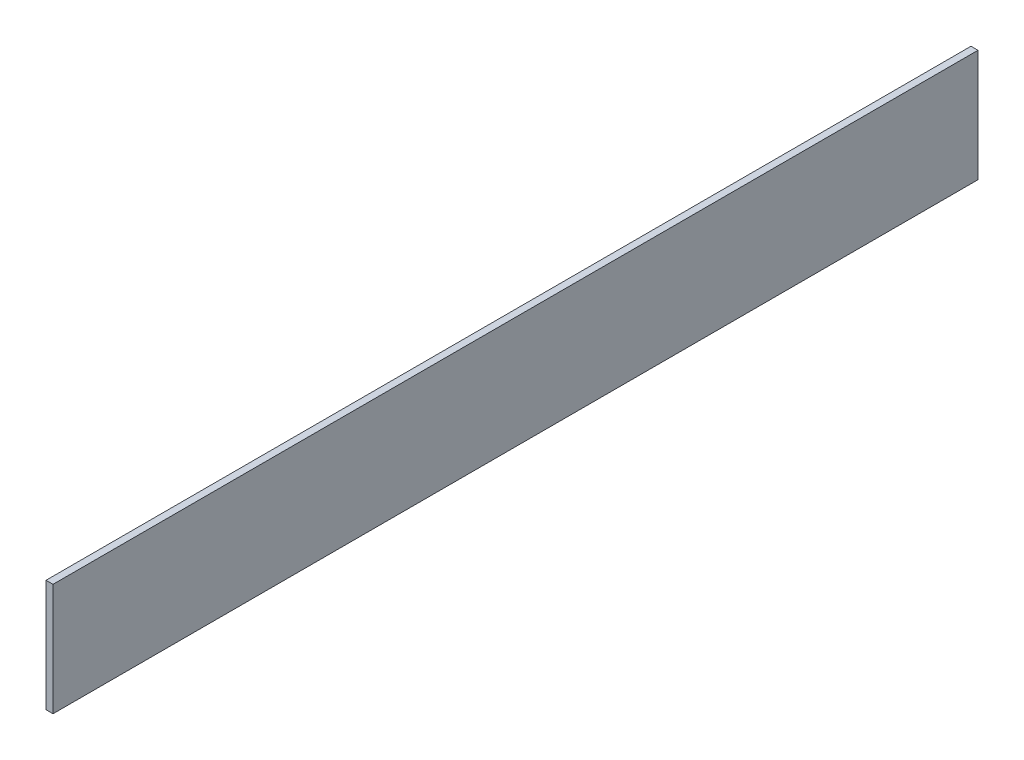
ISO-10303-21;
HEADER;
FILE_DESCRIPTION(('STEP AP214'),'2;1');
FILE_NAME('part.step','',(''),(''),'','','');
FILE_SCHEMA(('AUTOMOTIVE_DESIGN { 1 0 10303 214 1 1 1 1 }'));
ENDSEC;
DATA;
#1=APPLICATION_CONTEXT('core data for automotive mechanical design processes');
#2=APPLICATION_PROTOCOL_DEFINITION('international standard','automotive_design',2000,#1);
#3=PRODUCT_CONTEXT('',#1,'mechanical');
#4=PRODUCT('Part','Part','',(#3));
#5=PRODUCT_RELATED_PRODUCT_CATEGORY('part','',(#4));
#6=PRODUCT_DEFINITION_FORMATION('','',#4);
#7=PRODUCT_DEFINITION_CONTEXT('part definition',#1,'design');
#8=PRODUCT_DEFINITION('design','',#6,#7);
#9=PRODUCT_DEFINITION_SHAPE('','',#8);
#10=(LENGTH_UNIT() NAMED_UNIT(*) SI_UNIT(.MILLI.,.METRE.));
#11=(NAMED_UNIT(*) PLANE_ANGLE_UNIT() SI_UNIT($,.RADIAN.));
#12=(NAMED_UNIT(*) SI_UNIT($,.STERADIAN.) SOLID_ANGLE_UNIT());
#13=UNCERTAINTY_MEASURE_WITH_UNIT(LENGTH_MEASURE(1.E-05),#10,'distance_accuracy_value','');
#14=(GEOMETRIC_REPRESENTATION_CONTEXT(3) GLOBAL_UNCERTAINTY_ASSIGNED_CONTEXT((#13)) GLOBAL_UNIT_ASSIGNED_CONTEXT((#10,
#11,#12)) REPRESENTATION_CONTEXT('',''));
#15=CARTESIAN_POINT('',(0.,0.,0.));
#16=DIRECTION('',(0.,0.,1.));
#17=DIRECTION('',(1.,0.,0.));
#18=AXIS2_PLACEMENT_3D('',#15,#16,#17);
#19=CARTESIAN_POINT('',(185.,552.,-565.));
#20=DIRECTION('',(-1.,0.,0.));
#21=DIRECTION('',(0.,0.,1.));
#22=AXIS2_PLACEMENT_3D('',#19,#20,#21);
#23=PLANE('',#22);
#24=DIRECTION('',(0.,-1.,0.));
#25=VECTOR('',#24,1.);
#26=CARTESIAN_POINT('',(185.,552.,-235.));
#27=LINE('',#26,#25);
#28=CARTESIAN_POINT('',(185.,592.,-235.));
#29=VERTEX_POINT('',#28);
#30=CARTESIAN_POINT('',(185.,552.,-235.));
#31=VERTEX_POINT('',#30);
#32=EDGE_CURVE('E103',#29,#31,#27,.T.);
#33=ORIENTED_EDGE('',*,*,#32,.F.);
#34=DIRECTION('',(0.,0.,1.));
#35=VECTOR('',#34,1.);
#36=CARTESIAN_POINT('',(185.,592.,-565.));
#37=LINE('',#36,#35);
#38=CARTESIAN_POINT('',(185.,592.,-565.));
#39=VERTEX_POINT('',#38);
#40=EDGE_CURVE('E11',#39,#29,#37,.T.);
#41=ORIENTED_EDGE('',*,*,#40,.F.);
#42=DIRECTION('',(0.,-1.,0.));
#43=VECTOR('',#42,1.);
#44=CARTESIAN_POINT('',(185.,552.,-565.));
#45=LINE('',#44,#43);
#46=CARTESIAN_POINT('',(185.,552.,-565.));
#47=VERTEX_POINT('',#46);
#48=EDGE_CURVE('E97',#39,#47,#45,.T.);
#49=ORIENTED_EDGE('',*,*,#48,.T.);
#50=DIRECTION('',(0.,0.,1.));
#51=VECTOR('',#50,1.);
#52=CARTESIAN_POINT('',(185.,552.,-565.));
#53=LINE('',#52,#51);
#54=EDGE_CURVE('E42',#47,#31,#53,.T.);
#55=ORIENTED_EDGE('',*,*,#54,.T.);
#56=EDGE_LOOP('',(#33,#41,#49,#55));
#57=FACE_BOUND('',#56,.T.);
#58=ADVANCED_FACE('F39',(#57),#23,.T.);
#59=CARTESIAN_POINT('',(185.,592.,-565.));
#60=DIRECTION('',(0.,1.,0.));
#61=DIRECTION('',(0.,0.,1.));
#62=AXIS2_PLACEMENT_3D('',#59,#60,#61);
#63=PLANE('',#62);
#64=DIRECTION('',(-1.,0.,0.));
#65=VECTOR('',#64,1.);
#66=CARTESIAN_POINT('',(185.,592.,-235.));
#67=LINE('',#66,#65);
#68=CARTESIAN_POINT('',(187.5,592.,-235.));
#69=VERTEX_POINT('',#68);
#70=EDGE_CURVE('E99',#69,#29,#67,.T.);
#71=ORIENTED_EDGE('',*,*,#70,.F.);
#72=DIRECTION('',(0.,0.,1.));
#73=VECTOR('',#72,1.);
#74=CARTESIAN_POINT('',(187.5,592.,-565.));
#75=LINE('',#74,#73);
#76=CARTESIAN_POINT('',(187.5,592.,-565.));
#77=VERTEX_POINT('',#76);
#78=EDGE_CURVE('E48',#77,#69,#75,.T.);
#79=ORIENTED_EDGE('',*,*,#78,.F.);
#80=DIRECTION('',(-1.,0.,0.));
#81=VECTOR('',#80,1.);
#82=CARTESIAN_POINT('',(185.,592.,-565.));
#83=LINE('',#82,#81);
#84=EDGE_CURVE('E94',#77,#39,#83,.T.);
#85=ORIENTED_EDGE('',*,*,#84,.T.);
#86=ORIENTED_EDGE('',*,*,#40,.T.);
#87=EDGE_LOOP('',(#71,#79,#85,#86));
#88=FACE_BOUND('',#87,.T.);
#89=ADVANCED_FACE('F113',(#88),#63,.T.);
#90=CARTESIAN_POINT('',(187.5,552.,-565.));
#91=DIRECTION('',(1.,0.,0.));
#92=DIRECTION('',(0.,0.,-1.));
#93=AXIS2_PLACEMENT_3D('',#90,#91,#92);
#94=PLANE('',#93);
#95=DIRECTION('',(0.,1.,0.));
#96=VECTOR('',#95,1.);
#97=CARTESIAN_POINT('',(187.5,552.,-235.));
#98=LINE('',#97,#96);
#99=CARTESIAN_POINT('',(187.5,552.,-235.));
#100=VERTEX_POINT('',#99);
#101=EDGE_CURVE('E89',#100,#69,#98,.T.);
#102=ORIENTED_EDGE('',*,*,#101,.F.);
#103=DIRECTION('',(0.,0.,1.));
#104=VECTOR('',#103,1.);
#105=CARTESIAN_POINT('',(187.5,552.,-565.));
#106=LINE('',#105,#104);
#107=CARTESIAN_POINT('',(187.5,552.,-565.));
#108=VERTEX_POINT('',#107);
#109=EDGE_CURVE('E84',#108,#100,#106,.T.);
#110=ORIENTED_EDGE('',*,*,#109,.F.);
#111=DIRECTION('',(0.,1.,0.));
#112=VECTOR('',#111,1.);
#113=CARTESIAN_POINT('',(187.5,552.,-565.));
#114=LINE('',#113,#112);
#115=EDGE_CURVE('E87',#108,#77,#114,.T.);
#116=ORIENTED_EDGE('',*,*,#115,.T.);
#117=ORIENTED_EDGE('',*,*,#78,.T.);
#118=EDGE_LOOP('',(#102,#110,#116,#117));
#119=FACE_BOUND('',#118,.T.);
#120=ADVANCED_FACE('F86',(#119),#94,.T.);
#121=CARTESIAN_POINT('',(185.,552.,-565.));
#122=DIRECTION('',(0.,-1.,0.));
#123=DIRECTION('',(0.,0.,-1.));
#124=AXIS2_PLACEMENT_3D('',#121,#122,#123);
#125=PLANE('',#124);
#126=DIRECTION('',(1.,0.,0.));
#127=VECTOR('',#126,1.);
#128=CARTESIAN_POINT('',(185.,552.,-235.));
#129=LINE('',#128,#127);
#130=EDGE_CURVE('E106',#31,#100,#129,.T.);
#131=ORIENTED_EDGE('',*,*,#130,.F.);
#132=ORIENTED_EDGE('',*,*,#54,.F.);
#133=DIRECTION('',(1.,0.,0.));
#134=VECTOR('',#133,1.);
#135=CARTESIAN_POINT('',(185.,552.,-565.));
#136=LINE('',#135,#134);
#137=EDGE_CURVE('E93',#47,#108,#136,.T.);
#138=ORIENTED_EDGE('',*,*,#137,.T.);
#139=ORIENTED_EDGE('',*,*,#109,.T.);
#140=EDGE_LOOP('',(#131,#132,#138,#139));
#141=FACE_BOUND('',#140,.T.);
#142=ADVANCED_FACE('F96',(#141),#125,.T.);
#143=CARTESIAN_POINT('',(0.,0.,-565.));
#144=DIRECTION('',(0.,0.,-1.));
#145=DIRECTION('',(-1.,0.,0.));
#146=AXIS2_PLACEMENT_3D('',#143,#144,#145);
#147=PLANE('',#146);
#148=ORIENTED_EDGE('',*,*,#48,.F.);
#149=ORIENTED_EDGE('',*,*,#84,.F.);
#150=ORIENTED_EDGE('',*,*,#115,.F.);
#151=ORIENTED_EDGE('',*,*,#137,.F.);
#152=EDGE_LOOP('',(#148,#149,#150,#151));
#153=FACE_BOUND('',#152,.T.);
#154=ADVANCED_FACE('F92',(#153),#147,.T.);
#155=CARTESIAN_POINT('',(0.,0.,-235.));
#156=DIRECTION('',(0.,0.,-1.));
#157=DIRECTION('',(-1.,0.,0.));
#158=AXIS2_PLACEMENT_3D('',#155,#156,#157);
#159=PLANE('',#158);
#160=ORIENTED_EDGE('',*,*,#32,.T.);
#161=ORIENTED_EDGE('',*,*,#130,.T.);
#162=ORIENTED_EDGE('',*,*,#101,.T.);
#163=ORIENTED_EDGE('',*,*,#70,.T.);
#164=EDGE_LOOP('',(#160,#161,#162,#163));
#165=FACE_BOUND('',#164,.T.);
#166=ADVANCED_FACE('F112',(#165),#159,.F.);
#167=CLOSED_SHELL('',(#58,#89,#120,#142,#154,#166));
#168=MANIFOLD_SOLID_BREP('B2',#167);
#169=ADVANCED_BREP_SHAPE_REPRESENTATION('',(#18,#168),#14);
#170=SHAPE_DEFINITION_REPRESENTATION(#9,#169);
ENDSEC;
END-ISO-10303-21;
